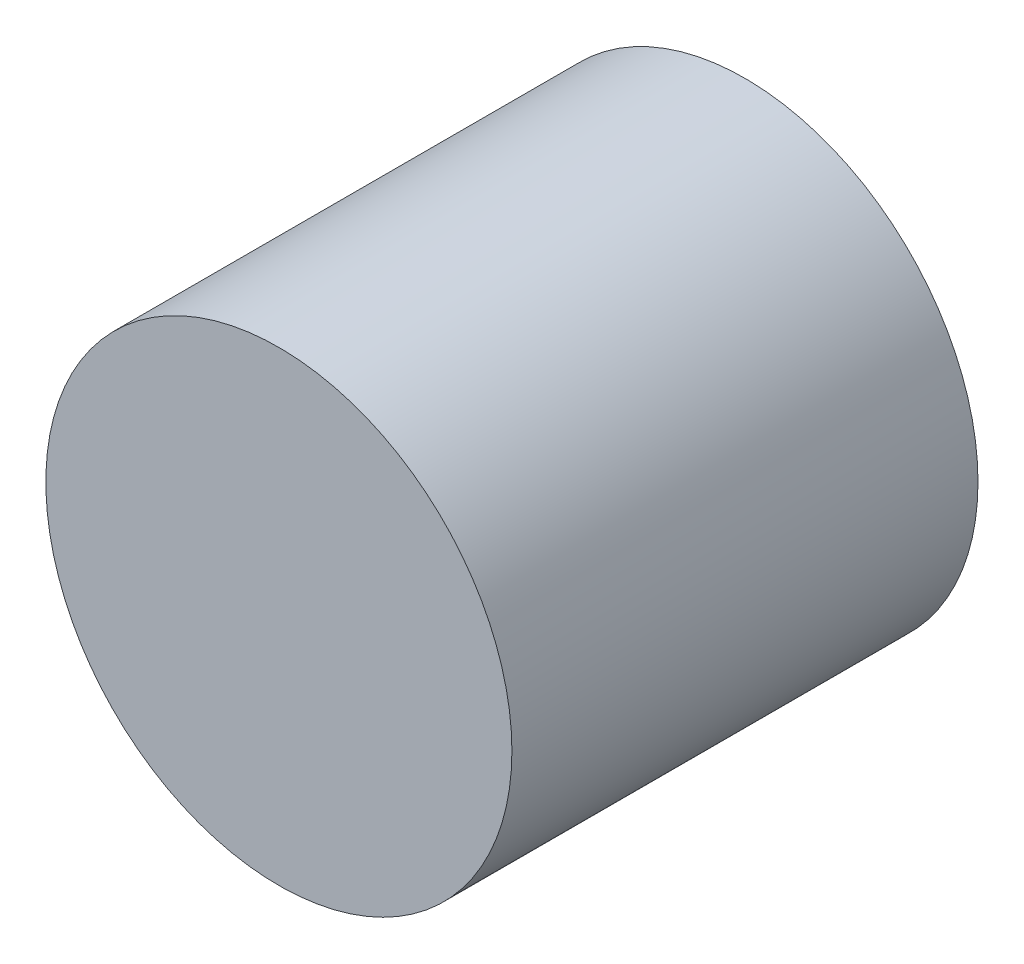
ISO-10303-21;
HEADER;
FILE_DESCRIPTION(('STEP AP214'),'2;1');
FILE_NAME('part.step','',(''),(''),'','','');
FILE_SCHEMA(('AUTOMOTIVE_DESIGN { 1 0 10303 214 1 1 1 1 }'));
ENDSEC;
DATA;
#1=APPLICATION_CONTEXT('core data for automotive mechanical design processes');
#2=APPLICATION_PROTOCOL_DEFINITION('international standard','automotive_design',2000,#1);
#3=PRODUCT_CONTEXT('',#1,'mechanical');
#4=PRODUCT('Part','Part','',(#3));
#5=PRODUCT_RELATED_PRODUCT_CATEGORY('part','',(#4));
#6=PRODUCT_DEFINITION_FORMATION('','',#4);
#7=PRODUCT_DEFINITION_CONTEXT('part definition',#1,'design');
#8=PRODUCT_DEFINITION('design','',#6,#7);
#9=PRODUCT_DEFINITION_SHAPE('','',#8);
#10=(LENGTH_UNIT() NAMED_UNIT(*) SI_UNIT(.MILLI.,.METRE.));
#11=(NAMED_UNIT(*) PLANE_ANGLE_UNIT() SI_UNIT($,.RADIAN.));
#12=(NAMED_UNIT(*) SI_UNIT($,.STERADIAN.) SOLID_ANGLE_UNIT());
#13=UNCERTAINTY_MEASURE_WITH_UNIT(LENGTH_MEASURE(1.E-05),#10,'distance_accuracy_value','');
#14=(GEOMETRIC_REPRESENTATION_CONTEXT(3) GLOBAL_UNCERTAINTY_ASSIGNED_CONTEXT((#13)) GLOBAL_UNIT_ASSIGNED_CONTEXT((#10,
#11,#12)) REPRESENTATION_CONTEXT('',''));
#15=CARTESIAN_POINT('',(0.,0.,0.));
#16=DIRECTION('',(0.,0.,1.));
#17=DIRECTION('',(1.,0.,0.));
#18=AXIS2_PLACEMENT_3D('',#15,#16,#17);
#19=CARTESIAN_POINT('',(0.,0.,2.));
#20=DIRECTION('',(0.,0.,-1.));
#21=DIRECTION('',(-1.,0.,0.));
#22=AXIS2_PLACEMENT_3D('',#19,#20,#21);
#23=CYLINDRICAL_SURFACE('',#22,1.);
#24=CARTESIAN_POINT('',(0.,0.,2.));
#25=DIRECTION('',(0.,0.,1.));
#26=DIRECTION('',(1.,0.,0.));
#27=AXIS2_PLACEMENT_3D('',#24,#25,#26);
#28=CIRCLE('',#27,1.);
#29=CARTESIAN_POINT('',(1.,0.,2.));
#30=VERTEX_POINT('',#29);
#31=EDGE_CURVE('E10',#30,#30,#28,.T.);
#32=ORIENTED_EDGE('',*,*,#31,.F.);
#33=EDGE_LOOP('',(#32));
#34=FACE_BOUND('',#33,.T.);
#35=CARTESIAN_POINT('',(0.,0.,0.));
#36=DIRECTION('',(0.,0.,1.));
#37=DIRECTION('',(1.,0.,0.));
#38=AXIS2_PLACEMENT_3D('',#35,#36,#37);
#39=CIRCLE('',#38,1.);
#40=CARTESIAN_POINT('',(1.,0.,0.));
#41=VERTEX_POINT('',#40);
#42=EDGE_CURVE('E44',#41,#41,#39,.T.);
#43=ORIENTED_EDGE('',*,*,#42,.T.);
#44=EDGE_LOOP('',(#43));
#45=FACE_BOUND('',#44,.T.);
#46=ADVANCED_FACE('F41',(#34,#45),#23,.T.);
#47=CARTESIAN_POINT('',(0.,0.,2.));
#48=DIRECTION('',(0.,0.,1.));
#49=DIRECTION('',(1.,0.,0.));
#50=AXIS2_PLACEMENT_3D('',#47,#48,#49);
#51=PLANE('',#50);
#52=ORIENTED_EDGE('',*,*,#31,.T.);
#53=EDGE_LOOP('',(#52));
#54=FACE_BOUND('',#53,.T.);
#55=ADVANCED_FACE('F58',(#54),#51,.T.);
#56=CARTESIAN_POINT('',(0.,0.,0.));
#57=DIRECTION('',(0.,0.,1.));
#58=DIRECTION('',(1.,0.,0.));
#59=AXIS2_PLACEMENT_3D('',#56,#57,#58);
#60=PLANE('',#59);
#61=ORIENTED_EDGE('',*,*,#42,.F.);
#62=EDGE_LOOP('',(#61));
#63=FACE_BOUND('',#62,.T.);
#64=ADVANCED_FACE('F56',(#63),#60,.F.);
#65=CLOSED_SHELL('',(#46,#55,#64));
#66=MANIFOLD_SOLID_BREP('B2',#65);
#67=ADVANCED_BREP_SHAPE_REPRESENTATION('',(#18,#66),#14);
#68=SHAPE_DEFINITION_REPRESENTATION(#9,#67);
ENDSEC;
END-ISO-10303-21;
